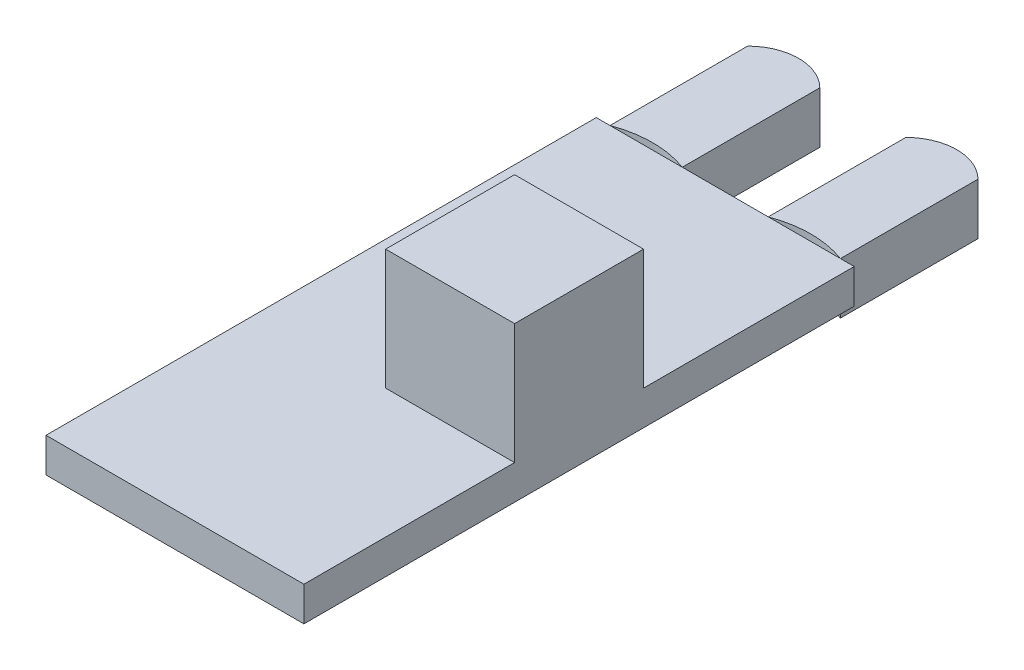
ISO-10303-21;
HEADER;
FILE_DESCRIPTION(('STEP AP214'),'2;1');
FILE_NAME('part.step','',(''),(''),'','','');
FILE_SCHEMA(('AUTOMOTIVE_DESIGN { 1 0 10303 214 1 1 1 1 }'));
ENDSEC;
DATA;
#1=APPLICATION_CONTEXT('core data for automotive mechanical design processes');
#2=APPLICATION_PROTOCOL_DEFINITION('international standard','automotive_design',2000,#1);
#3=PRODUCT_CONTEXT('',#1,'mechanical');
#4=PRODUCT('Part','Part','',(#3));
#5=PRODUCT_RELATED_PRODUCT_CATEGORY('part','',(#4));
#6=PRODUCT_DEFINITION_FORMATION('','',#4);
#7=PRODUCT_DEFINITION_CONTEXT('part definition',#1,'design');
#8=PRODUCT_DEFINITION('design','',#6,#7);
#9=PRODUCT_DEFINITION_SHAPE('','',#8);
#10=(LENGTH_UNIT() NAMED_UNIT(*) SI_UNIT(.MILLI.,.METRE.));
#11=(NAMED_UNIT(*) PLANE_ANGLE_UNIT() SI_UNIT($,.RADIAN.));
#12=(NAMED_UNIT(*) SI_UNIT($,.STERADIAN.) SOLID_ANGLE_UNIT());
#13=UNCERTAINTY_MEASURE_WITH_UNIT(LENGTH_MEASURE(1.E-05),#10,'distance_accuracy_value','');
#14=(GEOMETRIC_REPRESENTATION_CONTEXT(3) GLOBAL_UNCERTAINTY_ASSIGNED_CONTEXT((#13)) GLOBAL_UNIT_ASSIGNED_CONTEXT((#10,
#11,#12)) REPRESENTATION_CONTEXT('',''));
#15=CARTESIAN_POINT('',(0.,0.,0.));
#16=DIRECTION('',(0.,0.,1.));
#17=DIRECTION('',(1.,0.,0.));
#18=AXIS2_PLACEMENT_3D('',#15,#16,#17);
#19=CARTESIAN_POINT('',(-4.6,-1.,-10.3795018014414));
#20=DIRECTION('',(0.,1.,0.));
#21=DIRECTION('',(0.,0.,1.));
#22=AXIS2_PLACEMENT_3D('',#19,#20,#21);
#23=CYLINDRICAL_SURFACE('',#22,6.);
#24=CARTESIAN_POINT('',(-4.6,2.,-10.3795018014414));
#25=DIRECTION('',(0.,-1.,0.));
#26=DIRECTION('',(0.,0.,-1.));
#27=AXIS2_PLACEMENT_3D('',#24,#25,#26);
#28=CIRCLE('',#27,6.);
#29=CARTESIAN_POINT('',(-6.7,2.,-16.));
#30=VERTEX_POINT('',#29);
#31=CARTESIAN_POINT('',(-2.5,2.,-16.));
#32=VERTEX_POINT('',#31);
#33=EDGE_CURVE('E116',#30,#32,#28,.T.);
#34=ORIENTED_EDGE('',*,*,#33,.F.);
#35=DIRECTION('',(0.,1.,0.));
#36=VECTOR('',#35,1.);
#37=CARTESIAN_POINT('',(-6.7,-1.,-16.));
#38=LINE('',#37,#36);
#39=CARTESIAN_POINT('',(-6.7,-1.,-16.));
#40=VERTEX_POINT('',#39);
#41=EDGE_CURVE('E12',#40,#30,#38,.T.);
#42=ORIENTED_EDGE('',*,*,#41,.F.);
#43=CARTESIAN_POINT('',(-4.6,-1.,-10.3795018014414));
#44=DIRECTION('',(0.,-1.,0.));
#45=DIRECTION('',(0.,0.,-1.));
#46=AXIS2_PLACEMENT_3D('',#43,#44,#45);
#47=CIRCLE('',#46,6.);
#48=CARTESIAN_POINT('',(-2.5,-1.,-16.));
#49=VERTEX_POINT('',#48);
#50=EDGE_CURVE('E110',#40,#49,#47,.T.);
#51=ORIENTED_EDGE('',*,*,#50,.T.);
#52=DIRECTION('',(0.,1.,0.));
#53=VECTOR('',#52,1.);
#54=CARTESIAN_POINT('',(-2.5,-1.,-16.));
#55=LINE('',#54,#53);
#56=EDGE_CURVE('E55',#49,#32,#55,.T.);
#57=ORIENTED_EDGE('',*,*,#56,.T.);
#58=EDGE_LOOP('',(#34,#42,#51,#57));
#59=FACE_BOUND('',#58,.T.);
#60=ADVANCED_FACE('F52',(#59),#23,.F.);
#61=CARTESIAN_POINT('',(-6.7,-1.,-16.));
#62=DIRECTION('',(-1.,0.,0.));
#63=DIRECTION('',(0.,0.,1.));
#64=AXIS2_PLACEMENT_3D('',#61,#62,#63);
#65=PLANE('',#64);
#66=DIRECTION('',(0.,0.,1.));
#67=VECTOR('',#66,1.);
#68=CARTESIAN_POINT('',(-6.7,2.,-16.));
#69=LINE('',#68,#67);
#70=CARTESIAN_POINT('',(-6.7,2.,-24.));
#71=VERTEX_POINT('',#70);
#72=EDGE_CURVE('E112',#71,#30,#69,.T.);
#73=ORIENTED_EDGE('',*,*,#72,.F.);
#74=DIRECTION('',(0.,1.,0.));
#75=VECTOR('',#74,1.);
#76=CARTESIAN_POINT('',(-6.7,-1.,-24.));
#77=LINE('',#76,#75);
#78=CARTESIAN_POINT('',(-6.7,-1.,-24.));
#79=VERTEX_POINT('',#78);
#80=EDGE_CURVE('E61',#79,#71,#77,.T.);
#81=ORIENTED_EDGE('',*,*,#80,.F.);
#82=DIRECTION('',(0.,0.,1.));
#83=VECTOR('',#82,1.);
#84=CARTESIAN_POINT('',(-6.7,-1.,-16.));
#85=LINE('',#84,#83);
#86=EDGE_CURVE('E107',#79,#40,#85,.T.);
#87=ORIENTED_EDGE('',*,*,#86,.T.);
#88=ORIENTED_EDGE('',*,*,#41,.T.);
#89=EDGE_LOOP('',(#73,#81,#87,#88));
#90=FACE_BOUND('',#89,.T.);
#91=ADVANCED_FACE('F126',(#90),#65,.T.);
#92=CARTESIAN_POINT('',(-4.6,-1.,-21.9));
#93=DIRECTION('',(0.,1.,0.));
#94=DIRECTION('',(0.,0.,1.));
#95=AXIS2_PLACEMENT_3D('',#92,#93,#94);
#96=CYLINDRICAL_SURFACE('',#95,2.9698484809835);
#97=CARTESIAN_POINT('',(-4.6,2.,-21.9));
#98=DIRECTION('',(0.,1.,0.));
#99=DIRECTION('',(0.,0.,-1.));
#100=AXIS2_PLACEMENT_3D('',#97,#98,#99);
#101=CIRCLE('',#100,2.9698484809835);
#102=CARTESIAN_POINT('',(-2.5,2.,-24.));
#103=VERTEX_POINT('',#102);
#104=EDGE_CURVE('E102',#103,#71,#101,.T.);
#105=ORIENTED_EDGE('',*,*,#104,.F.);
#106=DIRECTION('',(0.,1.,0.));
#107=VECTOR('',#106,1.);
#108=CARTESIAN_POINT('',(-2.5,-1.,-24.));
#109=LINE('',#108,#107);
#110=CARTESIAN_POINT('',(-2.5,-1.,-24.));
#111=VERTEX_POINT('',#110);
#112=EDGE_CURVE('E97',#111,#103,#109,.T.);
#113=ORIENTED_EDGE('',*,*,#112,.F.);
#114=CARTESIAN_POINT('',(-4.6,-1.,-21.9));
#115=DIRECTION('',(0.,1.,0.));
#116=DIRECTION('',(0.,0.,-1.));
#117=AXIS2_PLACEMENT_3D('',#114,#115,#116);
#118=CIRCLE('',#117,2.9698484809835);
#119=EDGE_CURVE('E100',#111,#79,#118,.T.);
#120=ORIENTED_EDGE('',*,*,#119,.T.);
#121=ORIENTED_EDGE('',*,*,#80,.T.);
#122=EDGE_LOOP('',(#105,#113,#120,#121));
#123=FACE_BOUND('',#122,.T.);
#124=ADVANCED_FACE('F99',(#123),#96,.T.);
#125=CARTESIAN_POINT('',(-2.5,-1.,-24.));
#126=DIRECTION('',(1.,0.,0.));
#127=DIRECTION('',(0.,0.,-1.));
#128=AXIS2_PLACEMENT_3D('',#125,#126,#127);
#129=PLANE('',#128);
#130=DIRECTION('',(0.,0.,-1.));
#131=VECTOR('',#130,1.);
#132=CARTESIAN_POINT('',(-2.5,2.,-24.));
#133=LINE('',#132,#131);
#134=EDGE_CURVE('E119',#32,#103,#133,.T.);
#135=ORIENTED_EDGE('',*,*,#134,.F.);
#136=ORIENTED_EDGE('',*,*,#56,.F.);
#137=DIRECTION('',(0.,0.,-1.));
#138=VECTOR('',#137,1.);
#139=CARTESIAN_POINT('',(-2.5,-1.,-24.));
#140=LINE('',#139,#138);
#141=EDGE_CURVE('E106',#49,#111,#140,.T.);
#142=ORIENTED_EDGE('',*,*,#141,.T.);
#143=ORIENTED_EDGE('',*,*,#112,.T.);
#144=EDGE_LOOP('',(#135,#136,#142,#143));
#145=FACE_BOUND('',#144,.T.);
#146=ADVANCED_FACE('F109',(#145),#129,.T.);
#147=CARTESIAN_POINT('',(-4.6,-1.,-10.3795018014414));
#148=DIRECTION('',(0.,-1.,0.));
#149=DIRECTION('',(0.,0.,-1.));
#150=AXIS2_PLACEMENT_3D('',#147,#148,#149);
#151=PLANE('',#150);
#152=ORIENTED_EDGE('',*,*,#50,.F.);
#153=ORIENTED_EDGE('',*,*,#86,.F.);
#154=ORIENTED_EDGE('',*,*,#119,.F.);
#155=ORIENTED_EDGE('',*,*,#141,.F.);
#156=EDGE_LOOP('',(#152,#153,#154,#155));
#157=FACE_BOUND('',#156,.T.);
#158=ADVANCED_FACE('F105',(#157),#151,.T.);
#159=CARTESIAN_POINT('',(-4.6,2.,-10.3795018014414));
#160=DIRECTION('',(0.,-1.,0.));
#161=DIRECTION('',(0.,0.,-1.));
#162=AXIS2_PLACEMENT_3D('',#159,#160,#161);
#163=PLANE('',#162);
#164=ORIENTED_EDGE('',*,*,#33,.T.);
#165=ORIENTED_EDGE('',*,*,#134,.T.);
#166=ORIENTED_EDGE('',*,*,#104,.T.);
#167=ORIENTED_EDGE('',*,*,#72,.T.);
#168=EDGE_LOOP('',(#164,#165,#166,#167));
#169=FACE_BOUND('',#168,.T.);
#170=ADVANCED_FACE('F125',(#169),#163,.F.);
#171=CLOSED_SHELL('',(#60,#91,#124,#146,#158,#170));
#172=MANIFOLD_SOLID_BREP('B2',#171);
#173=CARTESIAN_POINT('',(4.6,-1.,-10.3795018014414));
#174=DIRECTION('',(0.,1.,0.));
#175=DIRECTION('',(0.,0.,1.));
#176=AXIS2_PLACEMENT_3D('',#173,#174,#175);
#177=CYLINDRICAL_SURFACE('',#176,6.);
#178=CARTESIAN_POINT('',(4.6,2.,-10.3795018014414));
#179=DIRECTION('',(0.,-1.,0.));
#180=DIRECTION('',(0.,0.,1.));
#181=AXIS2_PLACEMENT_3D('',#178,#179,#180);
#182=CIRCLE('',#181,6.);
#183=CARTESIAN_POINT('',(2.5,2.,-16.));
#184=VERTEX_POINT('',#183);
#185=CARTESIAN_POINT('',(6.7,2.,-16.));
#186=VERTEX_POINT('',#185);
#187=EDGE_CURVE('E257',#184,#186,#182,.T.);
#188=ORIENTED_EDGE('',*,*,#187,.F.);
#189=DIRECTION('',(0.,1.,0.));
#190=VECTOR('',#189,1.);
#191=CARTESIAN_POINT('',(2.5,-1.,-16.));
#192=LINE('',#191,#190);
#193=CARTESIAN_POINT('',(2.5,-1.,-16.));
#194=VERTEX_POINT('',#193);
#195=EDGE_CURVE('E50',#194,#184,#192,.T.);
#196=ORIENTED_EDGE('',*,*,#195,.F.);
#197=CARTESIAN_POINT('',(4.6,-1.,-10.3795018014414));
#198=DIRECTION('',(0.,-1.,0.));
#199=DIRECTION('',(0.,0.,1.));
#200=AXIS2_PLACEMENT_3D('',#197,#198,#199);
#201=CIRCLE('',#200,6.);
#202=CARTESIAN_POINT('',(6.7,-1.,-16.));
#203=VERTEX_POINT('',#202);
#204=EDGE_CURVE('E251',#194,#203,#201,.T.);
#205=ORIENTED_EDGE('',*,*,#204,.T.);
#206=DIRECTION('',(0.,1.,0.));
#207=VECTOR('',#206,1.);
#208=CARTESIAN_POINT('',(6.7,-1.,-16.));
#209=LINE('',#208,#207);
#210=EDGE_CURVE('E196',#203,#186,#209,.T.);
#211=ORIENTED_EDGE('',*,*,#210,.T.);
#212=EDGE_LOOP('',(#188,#196,#205,#211));
#213=FACE_BOUND('',#212,.T.);
#214=ADVANCED_FACE('F193',(#213),#177,.F.);
#215=CARTESIAN_POINT('',(2.5,-1.,-16.));
#216=DIRECTION('',(-1.,0.,0.));
#217=DIRECTION('',(0.,0.,1.));
#218=AXIS2_PLACEMENT_3D('',#215,#216,#217);
#219=PLANE('',#218);
#220=DIRECTION('',(0.,0.,1.));
#221=VECTOR('',#220,1.);
#222=CARTESIAN_POINT('',(2.5,2.,-16.));
#223=LINE('',#222,#221);
#224=CARTESIAN_POINT('',(2.5,2.,-24.));
#225=VERTEX_POINT('',#224);
#226=EDGE_CURVE('E253',#225,#184,#223,.T.);
#227=ORIENTED_EDGE('',*,*,#226,.F.);
#228=DIRECTION('',(0.,1.,0.));
#229=VECTOR('',#228,1.);
#230=CARTESIAN_POINT('',(2.5,-1.,-24.));
#231=LINE('',#230,#229);
#232=CARTESIAN_POINT('',(2.5,-1.,-24.));
#233=VERTEX_POINT('',#232);
#234=EDGE_CURVE('E202',#233,#225,#231,.T.);
#235=ORIENTED_EDGE('',*,*,#234,.F.);
#236=DIRECTION('',(0.,0.,1.));
#237=VECTOR('',#236,1.);
#238=CARTESIAN_POINT('',(2.5,-1.,-16.));
#239=LINE('',#238,#237);
#240=EDGE_CURVE('E248',#233,#194,#239,.T.);
#241=ORIENTED_EDGE('',*,*,#240,.T.);
#242=ORIENTED_EDGE('',*,*,#195,.T.);
#243=EDGE_LOOP('',(#227,#235,#241,#242));
#244=FACE_BOUND('',#243,.T.);
#245=ADVANCED_FACE('F267',(#244),#219,.T.);
#246=CARTESIAN_POINT('',(4.6,-1.,-21.9));
#247=DIRECTION('',(0.,1.,0.));
#248=DIRECTION('',(0.,0.,1.));
#249=AXIS2_PLACEMENT_3D('',#246,#247,#248);
#250=CYLINDRICAL_SURFACE('',#249,2.9698484809835);
#251=CARTESIAN_POINT('',(4.6,2.,-21.9));
#252=DIRECTION('',(0.,1.,0.));
#253=DIRECTION('',(0.,0.,-1.));
#254=AXIS2_PLACEMENT_3D('',#251,#252,#253);
#255=CIRCLE('',#254,2.9698484809835);
#256=CARTESIAN_POINT('',(6.7,2.,-24.));
#257=VERTEX_POINT('',#256);
#258=EDGE_CURVE('E243',#257,#225,#255,.T.);
#259=ORIENTED_EDGE('',*,*,#258,.F.);
#260=DIRECTION('',(0.,1.,0.));
#261=VECTOR('',#260,1.);
#262=CARTESIAN_POINT('',(6.7,-1.,-24.));
#263=LINE('',#262,#261);
#264=CARTESIAN_POINT('',(6.7,-1.,-24.));
#265=VERTEX_POINT('',#264);
#266=EDGE_CURVE('E238',#265,#257,#263,.T.);
#267=ORIENTED_EDGE('',*,*,#266,.F.);
#268=CARTESIAN_POINT('',(4.6,-1.,-21.9));
#269=DIRECTION('',(0.,1.,0.));
#270=DIRECTION('',(0.,0.,-1.));
#271=AXIS2_PLACEMENT_3D('',#268,#269,#270);
#272=CIRCLE('',#271,2.9698484809835);
#273=EDGE_CURVE('E241',#265,#233,#272,.T.);
#274=ORIENTED_EDGE('',*,*,#273,.T.);
#275=ORIENTED_EDGE('',*,*,#234,.T.);
#276=EDGE_LOOP('',(#259,#267,#274,#275));
#277=FACE_BOUND('',#276,.T.);
#278=ADVANCED_FACE('F240',(#277),#250,.T.);
#279=CARTESIAN_POINT('',(6.7,-1.,-24.));
#280=DIRECTION('',(1.,0.,0.));
#281=DIRECTION('',(0.,0.,-1.));
#282=AXIS2_PLACEMENT_3D('',#279,#280,#281);
#283=PLANE('',#282);
#284=DIRECTION('',(0.,0.,-1.));
#285=VECTOR('',#284,1.);
#286=CARTESIAN_POINT('',(6.7,2.,-24.));
#287=LINE('',#286,#285);
#288=EDGE_CURVE('E260',#186,#257,#287,.T.);
#289=ORIENTED_EDGE('',*,*,#288,.F.);
#290=ORIENTED_EDGE('',*,*,#210,.F.);
#291=DIRECTION('',(0.,0.,-1.));
#292=VECTOR('',#291,1.);
#293=CARTESIAN_POINT('',(6.7,-1.,-24.));
#294=LINE('',#293,#292);
#295=EDGE_CURVE('E247',#203,#265,#294,.T.);
#296=ORIENTED_EDGE('',*,*,#295,.T.);
#297=ORIENTED_EDGE('',*,*,#266,.T.);
#298=EDGE_LOOP('',(#289,#290,#296,#297));
#299=FACE_BOUND('',#298,.T.);
#300=ADVANCED_FACE('F250',(#299),#283,.T.);
#301=CARTESIAN_POINT('',(4.6,-1.,-10.3795018014414));
#302=DIRECTION('',(0.,1.,0.));
#303=DIRECTION('',(0.,0.,1.));
#304=AXIS2_PLACEMENT_3D('',#301,#302,#303);
#305=PLANE('',#304);
#306=ORIENTED_EDGE('',*,*,#204,.F.);
#307=ORIENTED_EDGE('',*,*,#240,.F.);
#308=ORIENTED_EDGE('',*,*,#273,.F.);
#309=ORIENTED_EDGE('',*,*,#295,.F.);
#310=EDGE_LOOP('',(#306,#307,#308,#309));
#311=FACE_BOUND('',#310,.T.);
#312=ADVANCED_FACE('F246',(#311),#305,.F.);
#313=CARTESIAN_POINT('',(4.6,2.,-10.3795018014414));
#314=DIRECTION('',(0.,1.,0.));
#315=DIRECTION('',(0.,0.,1.));
#316=AXIS2_PLACEMENT_3D('',#313,#314,#315);
#317=PLANE('',#316);
#318=ORIENTED_EDGE('',*,*,#187,.T.);
#319=ORIENTED_EDGE('',*,*,#288,.T.);
#320=ORIENTED_EDGE('',*,*,#258,.T.);
#321=ORIENTED_EDGE('',*,*,#226,.T.);
#322=EDGE_LOOP('',(#318,#319,#320,#321));
#323=FACE_BOUND('',#322,.T.);
#324=ADVANCED_FACE('F266',(#323),#317,.T.);
#325=CLOSED_SHELL('',(#214,#245,#278,#300,#312,#324));
#326=MANIFOLD_SOLID_BREP('B6',#325);
#327=CARTESIAN_POINT('',(7.5,2.,-16.));
#328=DIRECTION('',(-1.,0.,0.));
#329=DIRECTION('',(0.,0.,1.));
#330=AXIS2_PLACEMENT_3D('',#327,#328,#329);
#331=PLANE('',#330);
#332=DIRECTION('',(0.,0.,-1.));
#333=VECTOR('',#332,1.);
#334=CARTESIAN_POINT('',(7.5,0.,-16.));
#335=LINE('',#334,#333);
#336=CARTESIAN_POINT('',(7.5,0.,16.));
#337=VERTEX_POINT('',#336);
#338=CARTESIAN_POINT('',(7.5,0.,-16.));
#339=VERTEX_POINT('',#338);
#340=EDGE_CURVE('E415',#337,#339,#335,.T.);
#341=ORIENTED_EDGE('',*,*,#340,.T.);
#342=DIRECTION('',(0.,-1.,0.));
#343=VECTOR('',#342,1.);
#344=CARTESIAN_POINT('',(7.5,2.,-16.));
#345=LINE('',#344,#343);
#346=CARTESIAN_POINT('',(7.5,2.,-16.));
#347=VERTEX_POINT('',#346);
#348=EDGE_CURVE('E191',#347,#339,#345,.T.);
#349=ORIENTED_EDGE('',*,*,#348,.F.);
#350=DIRECTION('',(0.,0.,-1.));
#351=VECTOR('',#350,1.);
#352=CARTESIAN_POINT('',(7.5,2.,-16.));
#353=LINE('',#352,#351);
#354=CARTESIAN_POINT('',(7.5,2.,-3.75));
#355=VERTEX_POINT('',#354);
#356=EDGE_CURVE('E413',#355,#347,#353,.T.);
#357=ORIENTED_EDGE('',*,*,#356,.F.);
#358=DIRECTION('',(0.,-1.,0.));
#359=VECTOR('',#358,1.);
#360=CARTESIAN_POINT('',(7.50000000000001,9.,-3.75));
#361=LINE('',#360,#359);
#362=CARTESIAN_POINT('',(7.50000000000001,9.,-3.75));
#363=VERTEX_POINT('',#362);
#364=EDGE_CURVE('E393',#363,#355,#361,.T.);
#365=ORIENTED_EDGE('',*,*,#364,.F.);
#366=DIRECTION('',(0.,0.,-1.));
#367=VECTOR('',#366,1.);
#368=CARTESIAN_POINT('',(7.50000000000001,9.,-3.75));
#369=LINE('',#368,#367);
#370=CARTESIAN_POINT('',(7.50000000000001,9.,3.75));
#371=VERTEX_POINT('',#370);
#372=EDGE_CURVE('E400',#371,#363,#369,.T.);
#373=ORIENTED_EDGE('',*,*,#372,.F.);
#374=DIRECTION('',(0.,-1.,0.));
#375=VECTOR('',#374,1.);
#376=CARTESIAN_POINT('',(7.50000000000001,9.,3.75));
#377=LINE('',#376,#375);
#378=CARTESIAN_POINT('',(7.5,2.,3.75));
#379=VERTEX_POINT('',#378);
#380=EDGE_CURVE('E471',#371,#379,#377,.T.);
#381=ORIENTED_EDGE('',*,*,#380,.T.);
#382=CARTESIAN_POINT('',(7.5,2.,16.));
#383=VERTEX_POINT('',#382);
#384=EDGE_CURVE('E425',#383,#379,#353,.T.);
#385=ORIENTED_EDGE('',*,*,#384,.F.);
#386=DIRECTION('',(0.,-1.,0.));
#387=VECTOR('',#386,1.);
#388=CARTESIAN_POINT('',(7.5,2.,16.));
#389=LINE('',#388,#387);
#390=EDGE_CURVE('E436',#383,#337,#389,.T.);
#391=ORIENTED_EDGE('',*,*,#390,.T.);
#392=EDGE_LOOP('',(#341,#349,#357,#365,#373,#381,#385,#391));
#393=FACE_BOUND('',#392,.T.);
#394=ADVANCED_FACE('F325',(#393),#331,.F.);
#395=CARTESIAN_POINT('',(-7.5,2.,-16.));
#396=DIRECTION('',(0.,0.,1.));
#397=DIRECTION('',(1.,0.,0.));
#398=AXIS2_PLACEMENT_3D('',#395,#396,#397);
#399=PLANE('',#398);
#400=DIRECTION('',(-1.,0.,0.));
#401=VECTOR('',#400,1.);
#402=CARTESIAN_POINT('',(-7.5,0.,-16.));
#403=LINE('',#402,#401);
#404=CARTESIAN_POINT('',(-7.5,0.,-16.));
#405=VERTEX_POINT('',#404);
#406=EDGE_CURVE('E419',#339,#405,#403,.T.);
#407=ORIENTED_EDGE('',*,*,#406,.T.);
#408=DIRECTION('',(0.,-1.,0.));
#409=VECTOR('',#408,1.);
#410=CARTESIAN_POINT('',(-7.5,2.,-16.));
#411=LINE('',#410,#409);
#412=CARTESIAN_POINT('',(-7.5,2.,-16.));
#413=VERTEX_POINT('',#412);
#414=EDGE_CURVE('E333',#413,#405,#411,.T.);
#415=ORIENTED_EDGE('',*,*,#414,.F.);
#416=DIRECTION('',(-1.,0.,0.));
#417=VECTOR('',#416,1.);
#418=CARTESIAN_POINT('',(-7.5,2.,-16.));
#419=LINE('',#418,#417);
#420=EDGE_CURVE('E428',#347,#413,#419,.T.);
#421=ORIENTED_EDGE('',*,*,#420,.F.);
#422=ORIENTED_EDGE('',*,*,#348,.T.);
#423=EDGE_LOOP('',(#407,#415,#421,#422));
#424=FACE_BOUND('',#423,.T.);
#425=ADVANCED_FACE('F502',(#424),#399,.F.);
#426=CARTESIAN_POINT('',(-7.5,2.,-16.));
#427=DIRECTION('',(1.,0.,0.));
#428=DIRECTION('',(0.,0.,-1.));
#429=AXIS2_PLACEMENT_3D('',#426,#427,#428);
#430=PLANE('',#429);
#431=DIRECTION('',(0.,0.,1.));
#432=VECTOR('',#431,1.);
#433=CARTESIAN_POINT('',(-7.5,0.,-16.));
#434=LINE('',#433,#432);
#435=CARTESIAN_POINT('',(-7.5,0.,16.));
#436=VERTEX_POINT('',#435);
#437=EDGE_CURVE('E440',#405,#436,#434,.T.);
#438=ORIENTED_EDGE('',*,*,#437,.T.);
#439=DIRECTION('',(0.,-1.,0.));
#440=VECTOR('',#439,1.);
#441=CARTESIAN_POINT('',(-7.5,2.,16.));
#442=LINE('',#441,#440);
#443=CARTESIAN_POINT('',(-7.5,2.,16.));
#444=VERTEX_POINT('',#443);
#445=EDGE_CURVE('E449',#444,#436,#442,.T.);
#446=ORIENTED_EDGE('',*,*,#445,.F.);
#447=DIRECTION('',(0.,0.,1.));
#448=VECTOR('',#447,1.);
#449=CARTESIAN_POINT('',(-7.5,2.,-16.));
#450=LINE('',#449,#448);
#451=EDGE_CURVE('E431',#413,#444,#450,.T.);
#452=ORIENTED_EDGE('',*,*,#451,.F.);
#453=ORIENTED_EDGE('',*,*,#414,.T.);
#454=EDGE_LOOP('',(#438,#446,#452,#453));
#455=FACE_BOUND('',#454,.T.);
#456=ADVANCED_FACE('F458',(#455),#430,.F.);
#457=CARTESIAN_POINT('',(-7.5,2.,16.));
#458=DIRECTION('',(0.,0.,-1.));
#459=DIRECTION('',(-1.,0.,0.));
#460=AXIS2_PLACEMENT_3D('',#457,#458,#459);
#461=PLANE('',#460);
#462=DIRECTION('',(1.,0.,0.));
#463=VECTOR('',#462,1.);
#464=CARTESIAN_POINT('',(-7.5,0.,16.));
#465=LINE('',#464,#463);
#466=EDGE_CURVE('E443',#436,#337,#465,.T.);
#467=ORIENTED_EDGE('',*,*,#466,.T.);
#468=ORIENTED_EDGE('',*,*,#390,.F.);
#469=DIRECTION('',(1.,0.,0.));
#470=VECTOR('',#469,1.);
#471=CARTESIAN_POINT('',(-7.5,2.,16.));
#472=LINE('',#471,#470);
#473=EDGE_CURVE('E434',#444,#383,#472,.T.);
#474=ORIENTED_EDGE('',*,*,#473,.F.);
#475=ORIENTED_EDGE('',*,*,#445,.T.);
#476=EDGE_LOOP('',(#467,#468,#474,#475));
#477=FACE_BOUND('',#476,.T.);
#478=ADVANCED_FACE('F468',(#477),#461,.F.);
#479=CARTESIAN_POINT('',(0.,2.,0.));
#480=DIRECTION('',(0.,1.,0.));
#481=DIRECTION('',(0.,0.,1.));
#482=AXIS2_PLACEMENT_3D('',#479,#480,#481);
#483=PLANE('',#482);
#484=DIRECTION('',(1.,0.,0.));
#485=VECTOR('',#484,1.);
#486=CARTESIAN_POINT('',(0.,2.,3.75));
#487=LINE('',#486,#485);
#488=CARTESIAN_POINT('',(0.,2.,3.75));
#489=VERTEX_POINT('',#488);
#490=EDGE_CURVE('E340',#489,#379,#487,.T.);
#491=ORIENTED_EDGE('',*,*,#490,.F.);
#492=DIRECTION('',(0.,0.,1.));
#493=VECTOR('',#492,1.);
#494=CARTESIAN_POINT('',(0.,2.,-3.75));
#495=LINE('',#494,#493);
#496=CARTESIAN_POINT('',(0.,2.,-3.75));
#497=VERTEX_POINT('',#496);
#498=EDGE_CURVE('E478',#497,#489,#495,.T.);
#499=ORIENTED_EDGE('',*,*,#498,.F.);
#500=DIRECTION('',(-1.,0.,0.));
#501=VECTOR('',#500,1.);
#502=CARTESIAN_POINT('',(0.,2.,-3.75));
#503=LINE('',#502,#501);
#504=EDGE_CURVE('E346',#355,#497,#503,.T.);
#505=ORIENTED_EDGE('',*,*,#504,.F.);
#506=ORIENTED_EDGE('',*,*,#356,.T.);
#507=ORIENTED_EDGE('',*,*,#420,.T.);
#508=ORIENTED_EDGE('',*,*,#451,.T.);
#509=ORIENTED_EDGE('',*,*,#473,.T.);
#510=ORIENTED_EDGE('',*,*,#384,.T.);
#511=EDGE_LOOP('',(#491,#499,#505,#506,#507,#508,#509,#510));
#512=FACE_BOUND('',#511,.T.);
#513=ADVANCED_FACE('F472',(#512),#483,.T.);
#514=CARTESIAN_POINT('',(0.,0.,0.));
#515=DIRECTION('',(0.,1.,0.));
#516=DIRECTION('',(0.,0.,1.));
#517=AXIS2_PLACEMENT_3D('',#514,#515,#516);
#518=PLANE('',#517);
#519=ORIENTED_EDGE('',*,*,#340,.F.);
#520=ORIENTED_EDGE('',*,*,#466,.F.);
#521=ORIENTED_EDGE('',*,*,#437,.F.);
#522=ORIENTED_EDGE('',*,*,#406,.F.);
#523=EDGE_LOOP('',(#519,#520,#521,#522));
#524=FACE_BOUND('',#523,.T.);
#525=ADVANCED_FACE('F465',(#524),#518,.F.);
#526=CARTESIAN_POINT('',(0.,9.,-3.75));
#527=DIRECTION('',(0.,0.,1.));
#528=DIRECTION('',(1.,0.,0.));
#529=AXIS2_PLACEMENT_3D('',#526,#527,#528);
#530=PLANE('',#529);
#531=ORIENTED_EDGE('',*,*,#504,.T.);
#532=DIRECTION('',(0.,-1.,0.));
#533=VECTOR('',#532,1.);
#534=CARTESIAN_POINT('',(0.,9.,-3.75));
#535=LINE('',#534,#533);
#536=CARTESIAN_POINT('',(0.,9.,-3.75));
#537=VERTEX_POINT('',#536);
#538=EDGE_CURVE('E395',#537,#497,#535,.T.);
#539=ORIENTED_EDGE('',*,*,#538,.F.);
#540=DIRECTION('',(-1.,0.,0.));
#541=VECTOR('',#540,1.);
#542=CARTESIAN_POINT('',(0.,9.,-3.75));
#543=LINE('',#542,#541);
#544=EDGE_CURVE('E389',#363,#537,#543,.T.);
#545=ORIENTED_EDGE('',*,*,#544,.F.);
#546=ORIENTED_EDGE('',*,*,#364,.T.);
#547=EDGE_LOOP('',(#531,#539,#545,#546));
#548=FACE_BOUND('',#547,.T.);
#549=ADVANCED_FACE('F391',(#548),#530,.F.);
#550=CARTESIAN_POINT('',(0.,9.,-3.75));
#551=DIRECTION('',(1.,0.,0.));
#552=DIRECTION('',(0.,0.,-1.));
#553=AXIS2_PLACEMENT_3D('',#550,#551,#552);
#554=PLANE('',#553);
#555=ORIENTED_EDGE('',*,*,#498,.T.);
#556=DIRECTION('',(0.,-1.,0.));
#557=VECTOR('',#556,1.);
#558=CARTESIAN_POINT('',(0.,9.,3.75));
#559=LINE('',#558,#557);
#560=CARTESIAN_POINT('',(0.,9.,3.75));
#561=VERTEX_POINT('',#560);
#562=EDGE_CURVE('E421',#561,#489,#559,.T.);
#563=ORIENTED_EDGE('',*,*,#562,.F.);
#564=DIRECTION('',(0.,0.,1.));
#565=VECTOR('',#564,1.);
#566=CARTESIAN_POINT('',(0.,9.,-3.75));
#567=LINE('',#566,#565);
#568=EDGE_CURVE('E399',#537,#561,#567,.T.);
#569=ORIENTED_EDGE('',*,*,#568,.F.);
#570=ORIENTED_EDGE('',*,*,#538,.T.);
#571=EDGE_LOOP('',(#555,#563,#569,#570));
#572=FACE_BOUND('',#571,.T.);
#573=ADVANCED_FACE('F492',(#572),#554,.F.);
#574=CARTESIAN_POINT('',(0.,9.,3.75));
#575=DIRECTION('',(0.,0.,-1.));
#576=DIRECTION('',(-1.,0.,0.));
#577=AXIS2_PLACEMENT_3D('',#574,#575,#576);
#578=PLANE('',#577);
#579=ORIENTED_EDGE('',*,*,#490,.T.);
#580=ORIENTED_EDGE('',*,*,#380,.F.);
#581=DIRECTION('',(1.,0.,0.));
#582=VECTOR('',#581,1.);
#583=CARTESIAN_POINT('',(0.,9.,3.75));
#584=LINE('',#583,#582);
#585=EDGE_CURVE('E405',#561,#371,#584,.T.);
#586=ORIENTED_EDGE('',*,*,#585,.F.);
#587=ORIENTED_EDGE('',*,*,#562,.T.);
#588=EDGE_LOOP('',(#579,#580,#586,#587));
#589=FACE_BOUND('',#588,.T.);
#590=ADVANCED_FACE('F475',(#589),#578,.F.);
#591=CARTESIAN_POINT('',(0.,9.,0.));
#592=DIRECTION('',(0.,1.,0.));
#593=DIRECTION('',(0.,0.,1.));
#594=AXIS2_PLACEMENT_3D('',#591,#592,#593);
#595=PLANE('',#594);
#596=ORIENTED_EDGE('',*,*,#372,.T.);
#597=ORIENTED_EDGE('',*,*,#544,.T.);
#598=ORIENTED_EDGE('',*,*,#568,.T.);
#599=ORIENTED_EDGE('',*,*,#585,.T.);
#600=EDGE_LOOP('',(#596,#597,#598,#599));
#601=FACE_BOUND('',#600,.T.);
#602=ADVANCED_FACE('F403',(#601),#595,.T.);
#603=CLOSED_SHELL('',(#394,#425,#456,#478,#513,#525,#549,#573,#590,#602));
#604=MANIFOLD_SOLID_BREP('B44',#603);
#605=ADVANCED_BREP_SHAPE_REPRESENTATION('',(#18,#172,#326,#604),#14);
#606=SHAPE_DEFINITION_REPRESENTATION(#9,#605);
ENDSEC;
END-ISO-10303-21;
